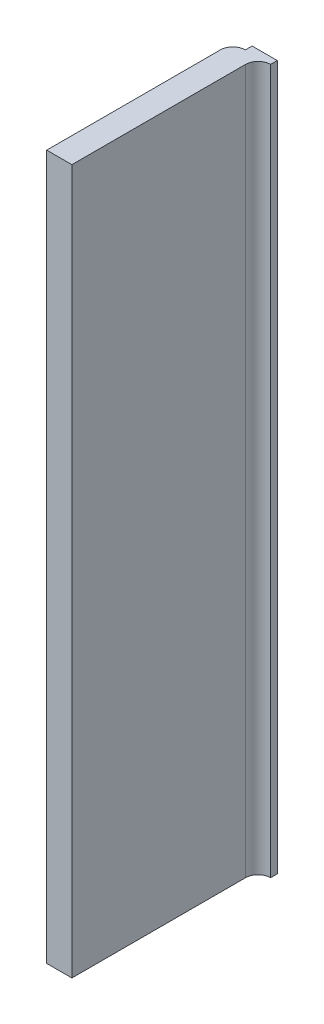
ISO-10303-21;
HEADER;
FILE_DESCRIPTION(('STEP AP214'),'2;1');
FILE_NAME('part.step','',(''),(''),'','','');
FILE_SCHEMA(('AUTOMOTIVE_DESIGN { 1 0 10303 214 1 1 1 1 }'));
ENDSEC;
DATA;
#1=APPLICATION_CONTEXT('core data for automotive mechanical design processes');
#2=APPLICATION_PROTOCOL_DEFINITION('international standard','automotive_design',2000,#1);
#3=PRODUCT_CONTEXT('',#1,'mechanical');
#4=PRODUCT('Part','Part','',(#3));
#5=PRODUCT_RELATED_PRODUCT_CATEGORY('part','',(#4));
#6=PRODUCT_DEFINITION_FORMATION('','',#4);
#7=PRODUCT_DEFINITION_CONTEXT('part definition',#1,'design');
#8=PRODUCT_DEFINITION('design','',#6,#7);
#9=PRODUCT_DEFINITION_SHAPE('','',#8);
#10=(LENGTH_UNIT() NAMED_UNIT(*) SI_UNIT(.MILLI.,.METRE.));
#11=(NAMED_UNIT(*) PLANE_ANGLE_UNIT() SI_UNIT($,.RADIAN.));
#12=(NAMED_UNIT(*) SI_UNIT($,.STERADIAN.) SOLID_ANGLE_UNIT());
#13=UNCERTAINTY_MEASURE_WITH_UNIT(LENGTH_MEASURE(1.E-05),#10,'distance_accuracy_value','');
#14=(GEOMETRIC_REPRESENTATION_CONTEXT(3) GLOBAL_UNCERTAINTY_ASSIGNED_CONTEXT((#13)) GLOBAL_UNIT_ASSIGNED_CONTEXT((#10,
#11,#12)) REPRESENTATION_CONTEXT('',''));
#15=CARTESIAN_POINT('',(0.,0.,0.));
#16=DIRECTION('',(0.,0.,1.));
#17=DIRECTION('',(1.,0.,0.));
#18=AXIS2_PLACEMENT_3D('',#15,#16,#17);
#19=CARTESIAN_POINT('',(5.81447012406557,168.,0.018803460412442));
#20=DIRECTION('',(0.,-1.,0.));
#21=DIRECTION('',(0.,0.,-1.));
#22=AXIS2_PLACEMENT_3D('',#19,#20,#21);
#23=CYLINDRICAL_SURFACE('',#22,2.98534007156359);
#24=CARTESIAN_POINT('',(5.81447012406557,0.,0.018803460412442));
#25=DIRECTION('',(0.,1.,0.));
#26=DIRECTION('',(0.,0.,1.));
#27=AXIS2_PLACEMENT_3D('',#24,#25,#26);
#28=CIRCLE('',#27,2.98534007156359);
#29=CARTESIAN_POINT('',(5.81447012406557,0.,-2.96653661115115));
#30=VERTEX_POINT('',#29);
#31=CARTESIAN_POINT('',(2.82913005250198,0.,0.0188034604124423));
#32=VERTEX_POINT('',#31);
#33=EDGE_CURVE('E134',#30,#32,#28,.T.);
#34=ORIENTED_EDGE('',*,*,#33,.F.);
#35=DIRECTION('',(0.,-1.,0.));
#36=VECTOR('',#35,1.);
#37=CARTESIAN_POINT('',(5.81447012406557,168.,-2.96653661115115));
#38=LINE('',#37,#36);
#39=CARTESIAN_POINT('',(5.81447012406557,168.,-2.96653661115115));
#40=VERTEX_POINT('',#39);
#41=EDGE_CURVE('E11',#40,#30,#38,.T.);
#42=ORIENTED_EDGE('',*,*,#41,.F.);
#43=CARTESIAN_POINT('',(5.81447012406557,168.,0.018803460412442));
#44=DIRECTION('',(0.,1.,0.));
#45=DIRECTION('',(0.,0.,1.));
#46=AXIS2_PLACEMENT_3D('',#43,#44,#45);
#47=CIRCLE('',#46,2.98534007156359);
#48=CARTESIAN_POINT('',(2.82913005250198,168.,0.0188034604124423));
#49=VERTEX_POINT('',#48);
#50=EDGE_CURVE('E153',#40,#49,#47,.T.);
#51=ORIENTED_EDGE('',*,*,#50,.T.);
#52=DIRECTION('',(0.,-1.,0.));
#53=VECTOR('',#52,1.);
#54=CARTESIAN_POINT('',(2.82913005250198,168.,0.0188034604124423));
#55=LINE('',#54,#53);
#56=EDGE_CURVE('E55',#49,#32,#55,.T.);
#57=ORIENTED_EDGE('',*,*,#56,.T.);
#58=EDGE_LOOP('',(#34,#42,#51,#57));
#59=FACE_BOUND('',#58,.T.);
#60=ADVANCED_FACE('F39',(#59),#23,.F.);
#61=CARTESIAN_POINT('',(5.81447012406557,168.,0.));
#62=DIRECTION('',(-1.,0.,0.));
#63=DIRECTION('',(0.,0.,1.));
#64=AXIS2_PLACEMENT_3D('',#61,#62,#63);
#65=PLANE('',#64);
#66=DIRECTION('',(0.,0.,-1.));
#67=VECTOR('',#66,1.);
#68=CARTESIAN_POINT('',(5.81447012406557,0.,0.));
#69=LINE('',#68,#67);
#70=CARTESIAN_POINT('',(5.81447012406557,0.,-4.56653661115115));
#71=VERTEX_POINT('',#70);
#72=EDGE_CURVE('E136',#30,#71,#69,.T.);
#73=ORIENTED_EDGE('',*,*,#72,.T.);
#74=DIRECTION('',(0.,-1.,0.));
#75=VECTOR('',#74,1.);
#76=CARTESIAN_POINT('',(5.81447012406557,168.,-4.56653661115115));
#77=LINE('',#76,#75);
#78=CARTESIAN_POINT('',(5.81447012406557,168.,-4.56653661115115));
#79=VERTEX_POINT('',#78);
#80=EDGE_CURVE('E47',#79,#71,#77,.T.);
#81=ORIENTED_EDGE('',*,*,#80,.F.);
#82=DIRECTION('',(0.,0.,-1.));
#83=VECTOR('',#82,1.);
#84=CARTESIAN_POINT('',(5.81447012406557,168.,0.));
#85=LINE('',#84,#83);
#86=EDGE_CURVE('E178',#40,#79,#85,.T.);
#87=ORIENTED_EDGE('',*,*,#86,.F.);
#88=ORIENTED_EDGE('',*,*,#41,.T.);
#89=EDGE_LOOP('',(#73,#81,#87,#88));
#90=FACE_BOUND('',#89,.T.);
#91=ADVANCED_FACE('F169',(#90),#65,.F.);
#92=CARTESIAN_POINT('',(0.,168.,-4.56653661115115));
#93=DIRECTION('',(0.,0.,-1.));
#94=DIRECTION('',(-1.,0.,0.));
#95=AXIS2_PLACEMENT_3D('',#92,#93,#94);
#96=PLANE('',#95);
#97=DIRECTION('',(1.,0.,0.));
#98=VECTOR('',#97,1.);
#99=CARTESIAN_POINT('',(0.,0.,-4.56653661115115));
#100=LINE('',#99,#98);
#101=CARTESIAN_POINT('',(-0.185529875934428,0.,-4.56653661115115));
#102=VERTEX_POINT('',#101);
#103=EDGE_CURVE('E139',#102,#71,#100,.T.);
#104=ORIENTED_EDGE('',*,*,#103,.F.);
#105=DIRECTION('',(0.,-1.,0.));
#106=VECTOR('',#105,1.);
#107=CARTESIAN_POINT('',(-0.185529875934428,168.,-4.56653661115115));
#108=LINE('',#107,#106);
#109=CARTESIAN_POINT('',(-0.185529875934428,168.,-4.56653661115115));
#110=VERTEX_POINT('',#109);
#111=EDGE_CURVE('E159',#110,#102,#108,.T.);
#112=ORIENTED_EDGE('',*,*,#111,.F.);
#113=DIRECTION('',(1.,0.,0.));
#114=VECTOR('',#113,1.);
#115=CARTESIAN_POINT('',(0.,168.,-4.56653661115115));
#116=LINE('',#115,#114);
#117=EDGE_CURVE('E166',#110,#79,#116,.T.);
#118=ORIENTED_EDGE('',*,*,#117,.T.);
#119=ORIENTED_EDGE('',*,*,#80,.T.);
#120=EDGE_LOOP('',(#104,#112,#118,#119));
#121=FACE_BOUND('',#120,.T.);
#122=ADVANCED_FACE('F164',(#121),#96,.T.);
#123=CARTESIAN_POINT('',(-0.185529875934428,168.,0.));
#124=DIRECTION('',(-1.,0.,0.));
#125=DIRECTION('',(0.,0.,1.));
#126=AXIS2_PLACEMENT_3D('',#123,#124,#125);
#127=PLANE('',#126);
#128=DIRECTION('',(0.,0.,-1.));
#129=VECTOR('',#128,1.);
#130=CARTESIAN_POINT('',(-0.185529875934428,0.,0.));
#131=LINE('',#130,#129);
#132=CARTESIAN_POINT('',(-0.185529875934428,0.,-2.96653661115115));
#133=VERTEX_POINT('',#132);
#134=EDGE_CURVE('E142',#133,#102,#131,.T.);
#135=ORIENTED_EDGE('',*,*,#134,.F.);
#136=DIRECTION('',(0.,-1.,0.));
#137=VECTOR('',#136,1.);
#138=CARTESIAN_POINT('',(-0.185529875934428,168.,-2.96653661115115));
#139=LINE('',#138,#137);
#140=CARTESIAN_POINT('',(-0.185529875934428,168.,-2.96653661115115));
#141=VERTEX_POINT('',#140);
#142=EDGE_CURVE('E157',#141,#133,#139,.T.);
#143=ORIENTED_EDGE('',*,*,#142,.F.);
#144=DIRECTION('',(0.,0.,-1.));
#145=VECTOR('',#144,1.);
#146=CARTESIAN_POINT('',(-0.185529875934428,168.,0.));
#147=LINE('',#146,#145);
#148=EDGE_CURVE('E177',#141,#110,#147,.T.);
#149=ORIENTED_EDGE('',*,*,#148,.T.);
#150=ORIENTED_EDGE('',*,*,#111,.T.);
#151=EDGE_LOOP('',(#135,#143,#149,#150));
#152=FACE_BOUND('',#151,.T.);
#153=ADVANCED_FACE('F175',(#152),#127,.T.);
#154=CARTESIAN_POINT('',(-0.185529875934427,168.,0.0188034604124429));
#155=DIRECTION('',(0.,-1.,0.));
#156=DIRECTION('',(0.,0.,-1.));
#157=AXIS2_PLACEMENT_3D('',#154,#155,#156);
#158=CYLINDRICAL_SURFACE('',#157,2.98534007156359);
#159=CARTESIAN_POINT('',(-0.185529875934427,0.,0.0188034604124429));
#160=DIRECTION('',(0.,1.,0.));
#161=DIRECTION('',(0.,0.,1.));
#162=AXIS2_PLACEMENT_3D('',#159,#160,#161);
#163=CIRCLE('',#162,2.98534007156359);
#164=CARTESIAN_POINT('',(-3.17086994749802,0.,0.0188034604124433));
#165=VERTEX_POINT('',#164);
#166=EDGE_CURVE('E145',#133,#165,#163,.T.);
#167=ORIENTED_EDGE('',*,*,#166,.T.);
#168=DIRECTION('',(0.,-1.,0.));
#169=VECTOR('',#168,1.);
#170=CARTESIAN_POINT('',(-3.17086994749802,168.,0.0188034604124433));
#171=LINE('',#170,#169);
#172=CARTESIAN_POINT('',(-3.17086994749802,168.,0.0188034604124433));
#173=VERTEX_POINT('',#172);
#174=EDGE_CURVE('E126',#173,#165,#171,.T.);
#175=ORIENTED_EDGE('',*,*,#174,.F.);
#176=CARTESIAN_POINT('',(-0.185529875934427,168.,0.0188034604124429));
#177=DIRECTION('',(0.,1.,0.));
#178=DIRECTION('',(0.,0.,1.));
#179=AXIS2_PLACEMENT_3D('',#176,#177,#178);
#180=CIRCLE('',#179,2.98534007156359);
#181=EDGE_CURVE('E114',#141,#173,#180,.T.);
#182=ORIENTED_EDGE('',*,*,#181,.F.);
#183=ORIENTED_EDGE('',*,*,#142,.T.);
#184=EDGE_LOOP('',(#167,#175,#182,#183));
#185=FACE_BOUND('',#184,.T.);
#186=ADVANCED_FACE('F204',(#185),#158,.T.);
#187=CARTESIAN_POINT('',(-3.17086994749802,168.,0.));
#188=DIRECTION('',(1.,0.,0.));
#189=DIRECTION('',(0.,0.,-1.));
#190=AXIS2_PLACEMENT_3D('',#187,#188,#189);
#191=PLANE('',#190);
#192=DIRECTION('',(0.,0.,1.));
#193=VECTOR('',#192,1.);
#194=CARTESIAN_POINT('',(-3.17086994749802,0.,0.));
#195=LINE('',#194,#193);
#196=CARTESIAN_POINT('',(-3.17086994749802,0.,41.4334633888488));
#197=VERTEX_POINT('',#196);
#198=EDGE_CURVE('E123',#165,#197,#195,.T.);
#199=ORIENTED_EDGE('',*,*,#198,.T.);
#200=DIRECTION('',(0.,-1.,0.));
#201=VECTOR('',#200,1.);
#202=CARTESIAN_POINT('',(-3.17086994749802,168.,41.4334633888488));
#203=LINE('',#202,#201);
#204=CARTESIAN_POINT('',(-3.17086994749802,168.,41.4334633888488));
#205=VERTEX_POINT('',#204);
#206=EDGE_CURVE('E120',#205,#197,#203,.T.);
#207=ORIENTED_EDGE('',*,*,#206,.F.);
#208=DIRECTION('',(0.,0.,1.));
#209=VECTOR('',#208,1.);
#210=CARTESIAN_POINT('',(-3.17086994749802,168.,0.));
#211=LINE('',#210,#209);
#212=EDGE_CURVE('E105',#173,#205,#211,.T.);
#213=ORIENTED_EDGE('',*,*,#212,.F.);
#214=ORIENTED_EDGE('',*,*,#174,.T.);
#215=EDGE_LOOP('',(#199,#207,#213,#214));
#216=FACE_BOUND('',#215,.T.);
#217=ADVANCED_FACE('F121',(#216),#191,.F.);
#218=CARTESIAN_POINT('',(0.,168.,41.4334633888488));
#219=DIRECTION('',(0.,0.,-1.));
#220=DIRECTION('',(-1.,0.,0.));
#221=AXIS2_PLACEMENT_3D('',#218,#219,#220);
#222=PLANE('',#221);
#223=DIRECTION('',(1.,0.,0.));
#224=VECTOR('',#223,1.);
#225=CARTESIAN_POINT('',(0.,0.,41.4334633888488));
#226=LINE('',#225,#224);
#227=CARTESIAN_POINT('',(2.82913005250199,0.,41.4334633888488));
#228=VERTEX_POINT('',#227);
#229=EDGE_CURVE('E148',#197,#228,#226,.T.);
#230=ORIENTED_EDGE('',*,*,#229,.T.);
#231=DIRECTION('',(0.,-1.,0.));
#232=VECTOR('',#231,1.);
#233=CARTESIAN_POINT('',(2.82913005250199,168.,41.4334633888488));
#234=LINE('',#233,#232);
#235=CARTESIAN_POINT('',(2.82913005250199,168.,41.4334633888488));
#236=VERTEX_POINT('',#235);
#237=EDGE_CURVE('E81',#236,#228,#234,.T.);
#238=ORIENTED_EDGE('',*,*,#237,.F.);
#239=DIRECTION('',(1.,0.,0.));
#240=VECTOR('',#239,1.);
#241=CARTESIAN_POINT('',(0.,168.,41.4334633888488));
#242=LINE('',#241,#240);
#243=EDGE_CURVE('E111',#205,#236,#242,.T.);
#244=ORIENTED_EDGE('',*,*,#243,.F.);
#245=ORIENTED_EDGE('',*,*,#206,.T.);
#246=EDGE_LOOP('',(#230,#238,#244,#245));
#247=FACE_BOUND('',#246,.T.);
#248=ADVANCED_FACE('F128',(#247),#222,.F.);
#249=CARTESIAN_POINT('',(2.82913005250198,168.,0.));
#250=DIRECTION('',(1.,0.,0.));
#251=DIRECTION('',(0.,0.,-1.));
#252=AXIS2_PLACEMENT_3D('',#249,#250,#251);
#253=PLANE('',#252);
#254=DIRECTION('',(0.,0.,1.));
#255=VECTOR('',#254,1.);
#256=CARTESIAN_POINT('',(2.82913005250198,0.,0.));
#257=LINE('',#256,#255);
#258=EDGE_CURVE('E150',#32,#228,#257,.T.);
#259=ORIENTED_EDGE('',*,*,#258,.F.);
#260=ORIENTED_EDGE('',*,*,#56,.F.);
#261=DIRECTION('',(0.,0.,1.));
#262=VECTOR('',#261,1.);
#263=CARTESIAN_POINT('',(2.82913005250198,168.,0.));
#264=LINE('',#263,#262);
#265=EDGE_CURVE('E129',#49,#236,#264,.T.);
#266=ORIENTED_EDGE('',*,*,#265,.T.);
#267=ORIENTED_EDGE('',*,*,#237,.T.);
#268=EDGE_LOOP('',(#259,#260,#266,#267));
#269=FACE_BOUND('',#268,.T.);
#270=ADVANCED_FACE('F183',(#269),#253,.T.);
#271=CARTESIAN_POINT('',(0.,168.,0.));
#272=DIRECTION('',(0.,1.,0.));
#273=DIRECTION('',(0.,0.,1.));
#274=AXIS2_PLACEMENT_3D('',#271,#272,#273);
#275=PLANE('',#274);
#276=ORIENTED_EDGE('',*,*,#50,.F.);
#277=ORIENTED_EDGE('',*,*,#86,.T.);
#278=ORIENTED_EDGE('',*,*,#117,.F.);
#279=ORIENTED_EDGE('',*,*,#148,.F.);
#280=ORIENTED_EDGE('',*,*,#181,.T.);
#281=ORIENTED_EDGE('',*,*,#212,.T.);
#282=ORIENTED_EDGE('',*,*,#243,.T.);
#283=ORIENTED_EDGE('',*,*,#265,.F.);
#284=EDGE_LOOP('',(#276,#277,#278,#279,#280,#281,#282,#283));
#285=FACE_BOUND('',#284,.T.);
#286=ADVANCED_FACE('F108',(#285),#275,.T.);
#287=CARTESIAN_POINT('',(0.,0.,0.));
#288=DIRECTION('',(0.,1.,0.));
#289=DIRECTION('',(0.,0.,1.));
#290=AXIS2_PLACEMENT_3D('',#287,#288,#289);
#291=PLANE('',#290);
#292=ORIENTED_EDGE('',*,*,#33,.T.);
#293=ORIENTED_EDGE('',*,*,#258,.T.);
#294=ORIENTED_EDGE('',*,*,#229,.F.);
#295=ORIENTED_EDGE('',*,*,#198,.F.);
#296=ORIENTED_EDGE('',*,*,#166,.F.);
#297=ORIENTED_EDGE('',*,*,#134,.T.);
#298=ORIENTED_EDGE('',*,*,#103,.T.);
#299=ORIENTED_EDGE('',*,*,#72,.F.);
#300=EDGE_LOOP('',(#292,#293,#294,#295,#296,#297,#298,#299));
#301=FACE_BOUND('',#300,.T.);
#302=ADVANCED_FACE('F171',(#301),#291,.F.);
#303=CLOSED_SHELL('',(#60,#91,#122,#153,#186,#217,#248,#270,#286,#302));
#304=MANIFOLD_SOLID_BREP('B2',#303);
#305=ADVANCED_BREP_SHAPE_REPRESENTATION('',(#18,#304),#14);
#306=SHAPE_DEFINITION_REPRESENTATION(#9,#305);
ENDSEC;
END-ISO-10303-21;
